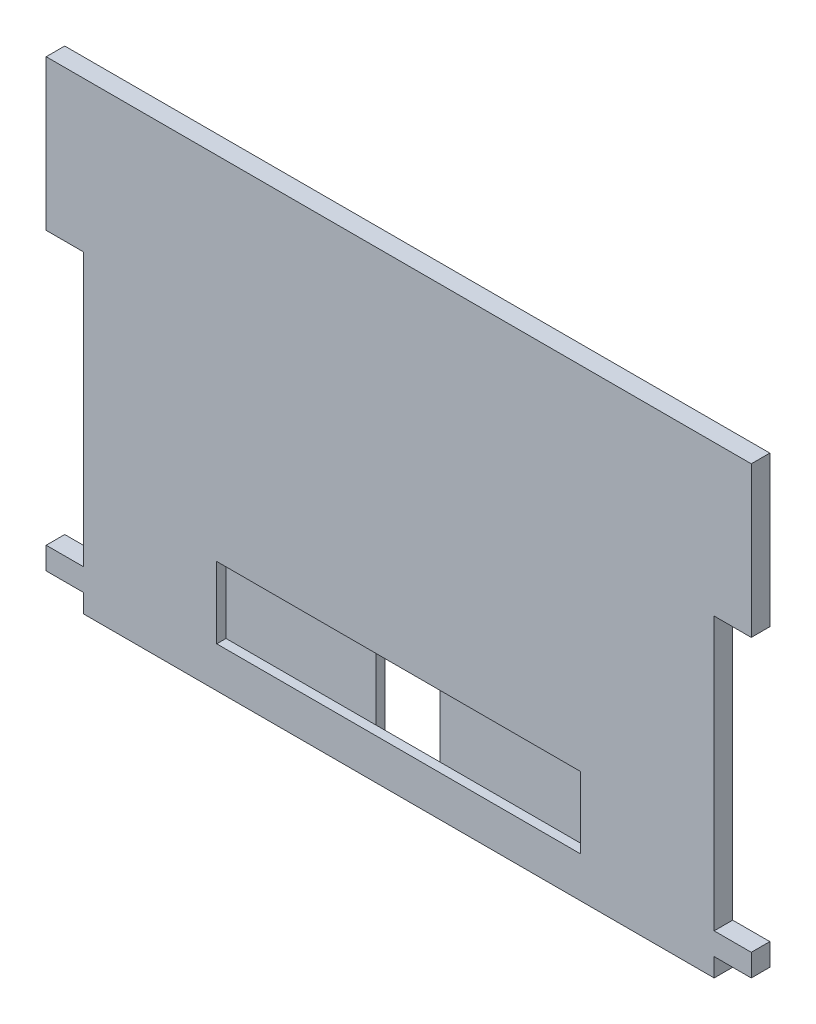
ISO-10303-21;
HEADER;
FILE_DESCRIPTION(('STEP AP214'),'2;1');
FILE_NAME('part.step','',(''),(''),'','','');
FILE_SCHEMA(('AUTOMOTIVE_DESIGN { 1 0 10303 214 1 1 1 1 }'));
ENDSEC;
DATA;
#1=APPLICATION_CONTEXT('core data for automotive mechanical design processes');
#2=APPLICATION_PROTOCOL_DEFINITION('international standard','automotive_design',2000,#1);
#3=PRODUCT_CONTEXT('',#1,'mechanical');
#4=PRODUCT('Part','Part','',(#3));
#5=PRODUCT_RELATED_PRODUCT_CATEGORY('part','',(#4));
#6=PRODUCT_DEFINITION_FORMATION('','',#4);
#7=PRODUCT_DEFINITION_CONTEXT('part definition',#1,'design');
#8=PRODUCT_DEFINITION('design','',#6,#7);
#9=PRODUCT_DEFINITION_SHAPE('','',#8);
#10=(LENGTH_UNIT() NAMED_UNIT(*) SI_UNIT(.MILLI.,.METRE.));
#11=(NAMED_UNIT(*) PLANE_ANGLE_UNIT() SI_UNIT($,.RADIAN.));
#12=(NAMED_UNIT(*) SI_UNIT($,.STERADIAN.) SOLID_ANGLE_UNIT());
#13=UNCERTAINTY_MEASURE_WITH_UNIT(LENGTH_MEASURE(1.E-05),#10,'distance_accuracy_value','');
#14=(GEOMETRIC_REPRESENTATION_CONTEXT(3) GLOBAL_UNCERTAINTY_ASSIGNED_CONTEXT((#13)) GLOBAL_UNIT_ASSIGNED_CONTEXT((#10,
#11,#12)) REPRESENTATION_CONTEXT('',''));
#15=CARTESIAN_POINT('',(0.,0.,0.));
#16=DIRECTION('',(0.,0.,1.));
#17=DIRECTION('',(1.,0.,0.));
#18=AXIS2_PLACEMENT_3D('',#15,#16,#17);
#19=CARTESIAN_POINT('',(0.,0.,1.));
#20=DIRECTION('',(0.,0.,-1.));
#21=DIRECTION('',(-1.,0.,0.));
#22=AXIS2_PLACEMENT_3D('',#19,#20,#21);
#23=PLANE('',#22);
#24=DIRECTION('',(1.,0.,0.));
#25=VECTOR('',#24,1.);
#26=CARTESIAN_POINT('',(-19.,1.5,1.));
#27=LINE('',#26,#25);
#28=CARTESIAN_POINT('',(-19.,1.5,1.));
#29=VERTEX_POINT('',#28);
#30=CARTESIAN_POINT('',(-17.,1.5,1.));
#31=VERTEX_POINT('',#30);
#32=EDGE_CURVE('E232',#29,#31,#27,.T.);
#33=ORIENTED_EDGE('',*,*,#32,.T.);
#34=DIRECTION('',(0.,-1.,0.));
#35=VECTOR('',#34,1.);
#36=CARTESIAN_POINT('',(-17.,1.5,1.));
#37=LINE('',#36,#35);
#38=CARTESIAN_POINT('',(-17.,0.5,1.));
#39=VERTEX_POINT('',#38);
#40=EDGE_CURVE('E131',#31,#39,#37,.T.);
#41=ORIENTED_EDGE('',*,*,#40,.T.);
#42=DIRECTION('',(1.,0.,0.));
#43=VECTOR('',#42,1.);
#44=CARTESIAN_POINT('',(-17.,0.5,1.));
#45=LINE('',#44,#43);
#46=CARTESIAN_POINT('',(17.,0.5,1.));
#47=VERTEX_POINT('',#46);
#48=EDGE_CURVE('E237',#39,#47,#45,.T.);
#49=ORIENTED_EDGE('',*,*,#48,.T.);
#50=DIRECTION('',(0.,1.,0.));
#51=VECTOR('',#50,1.);
#52=CARTESIAN_POINT('',(17.,0.5,1.));
#53=LINE('',#52,#51);
#54=CARTESIAN_POINT('',(17.,1.5,1.));
#55=VERTEX_POINT('',#54);
#56=EDGE_CURVE('E239',#47,#55,#53,.T.);
#57=ORIENTED_EDGE('',*,*,#56,.T.);
#58=DIRECTION('',(1.,0.,0.));
#59=VECTOR('',#58,1.);
#60=CARTESIAN_POINT('',(17.,1.5,1.));
#61=LINE('',#60,#59);
#62=CARTESIAN_POINT('',(19.,1.5,1.));
#63=VERTEX_POINT('',#62);
#64=EDGE_CURVE('E238',#55,#63,#61,.T.);
#65=ORIENTED_EDGE('',*,*,#64,.T.);
#66=DIRECTION('',(0.,1.,0.));
#67=VECTOR('',#66,1.);
#68=CARTESIAN_POINT('',(19.,1.5,1.));
#69=LINE('',#68,#67);
#70=CARTESIAN_POINT('',(19.,2.7,1.));
#71=VERTEX_POINT('',#70);
#72=EDGE_CURVE('E244',#63,#71,#69,.T.);
#73=ORIENTED_EDGE('',*,*,#72,.T.);
#74=DIRECTION('',(-1.,0.,0.));
#75=VECTOR('',#74,1.);
#76=CARTESIAN_POINT('',(19.,2.7,1.));
#77=LINE('',#76,#75);
#78=CARTESIAN_POINT('',(17.,2.7,1.));
#79=VERTEX_POINT('',#78);
#80=EDGE_CURVE('E241',#71,#79,#77,.T.);
#81=ORIENTED_EDGE('',*,*,#80,.T.);
#82=DIRECTION('',(0.,1.,0.));
#83=VECTOR('',#82,1.);
#84=CARTESIAN_POINT('',(17.,2.7,1.));
#85=LINE('',#84,#83);
#86=CARTESIAN_POINT('',(17.,17.3947217067352,1.));
#87=VERTEX_POINT('',#86);
#88=EDGE_CURVE('E247',#79,#87,#85,.T.);
#89=ORIENTED_EDGE('',*,*,#88,.T.);
#90=DIRECTION('',(1.,0.,0.));
#91=VECTOR('',#90,1.);
#92=CARTESIAN_POINT('',(17.,17.3947217067352,1.));
#93=LINE('',#92,#91);
#94=CARTESIAN_POINT('',(19.,17.3947217067352,1.));
#95=VERTEX_POINT('',#94);
#96=EDGE_CURVE('E246',#87,#95,#93,.T.);
#97=ORIENTED_EDGE('',*,*,#96,.T.);
#98=DIRECTION('',(0.,1.,0.));
#99=VECTOR('',#98,1.);
#100=CARTESIAN_POINT('',(19.,17.3947217067352,1.));
#101=LINE('',#100,#99);
#102=CARTESIAN_POINT('',(19.,25.5,1.));
#103=VERTEX_POINT('',#102);
#104=EDGE_CURVE('E248',#95,#103,#101,.T.);
#105=ORIENTED_EDGE('',*,*,#104,.T.);
#106=DIRECTION('',(-1.,0.,0.));
#107=VECTOR('',#106,1.);
#108=CARTESIAN_POINT('',(19.,25.5,1.));
#109=LINE('',#108,#107);
#110=CARTESIAN_POINT('',(-19.,25.5,1.));
#111=VERTEX_POINT('',#110);
#112=EDGE_CURVE('E254',#103,#111,#109,.T.);
#113=ORIENTED_EDGE('',*,*,#112,.T.);
#114=DIRECTION('',(0.,-1.,0.));
#115=VECTOR('',#114,1.);
#116=CARTESIAN_POINT('',(-19.,25.5,1.));
#117=LINE('',#116,#115);
#118=CARTESIAN_POINT('',(-19.,17.3947217067352,1.));
#119=VERTEX_POINT('',#118);
#120=EDGE_CURVE('E251',#111,#119,#117,.T.);
#121=ORIENTED_EDGE('',*,*,#120,.T.);
#122=DIRECTION('',(1.,0.,0.));
#123=VECTOR('',#122,1.);
#124=CARTESIAN_POINT('',(-19.,17.3947217067352,1.));
#125=LINE('',#124,#123);
#126=CARTESIAN_POINT('',(-17.,17.3947217067352,1.));
#127=VERTEX_POINT('',#126);
#128=EDGE_CURVE('E258',#119,#127,#125,.T.);
#129=ORIENTED_EDGE('',*,*,#128,.T.);
#130=DIRECTION('',(0.,-1.,0.));
#131=VECTOR('',#130,1.);
#132=CARTESIAN_POINT('',(-17.,17.3947217067352,1.));
#133=LINE('',#132,#131);
#134=CARTESIAN_POINT('',(-17.,2.7,1.));
#135=VERTEX_POINT('',#134);
#136=EDGE_CURVE('E256',#127,#135,#133,.T.);
#137=ORIENTED_EDGE('',*,*,#136,.T.);
#138=DIRECTION('',(-1.,0.,0.));
#139=VECTOR('',#138,1.);
#140=CARTESIAN_POINT('',(-17.,2.7,1.));
#141=LINE('',#140,#139);
#142=CARTESIAN_POINT('',(-19.,2.7,1.));
#143=VERTEX_POINT('',#142);
#144=EDGE_CURVE('E259',#135,#143,#141,.T.);
#145=ORIENTED_EDGE('',*,*,#144,.T.);
#146=DIRECTION('',(0.,-1.,0.));
#147=VECTOR('',#146,1.);
#148=CARTESIAN_POINT('',(-19.,2.7,1.));
#149=LINE('',#148,#147);
#150=EDGE_CURVE('E265',#143,#29,#149,.T.);
#151=ORIENTED_EDGE('',*,*,#150,.T.);
#152=EDGE_LOOP('',(#33,#41,#49,#57,#65,#73,#81,#89,#97,#105,#113,#121,#129,#137,#145,#151));
#153=FACE_BOUND('',#152,.T.);
#154=DIRECTION('',(0.,1.,0.));
#155=VECTOR('',#154,1.);
#156=CARTESIAN_POINT('',(-9.80769230769231,2.69230769230769,1.));
#157=LINE('',#156,#155);
#158=CARTESIAN_POINT('',(-9.80769230769231,2.69230769230769,1.));
#159=VERTEX_POINT('',#158);
#160=CARTESIAN_POINT('',(-9.80769230769231,6.53846153846154,1.));
#161=VERTEX_POINT('',#160);
#162=EDGE_CURVE('E58',#159,#161,#157,.T.);
#163=ORIENTED_EDGE('',*,*,#162,.T.);
#164=DIRECTION('',(1.,0.,0.));
#165=VECTOR('',#164,1.);
#166=CARTESIAN_POINT('',(-9.80769230769231,6.53846153846154,1.));
#167=LINE('',#166,#165);
#168=CARTESIAN_POINT('',(9.8076923076923,6.53846153846154,1.));
#169=VERTEX_POINT('',#168);
#170=EDGE_CURVE('E531',#161,#169,#167,.T.);
#171=ORIENTED_EDGE('',*,*,#170,.T.);
#172=DIRECTION('',(0.,-1.,0.));
#173=VECTOR('',#172,1.);
#174=CARTESIAN_POINT('',(9.8076923076923,6.53846153846154,1.));
#175=LINE('',#174,#173);
#176=CARTESIAN_POINT('',(9.8076923076923,2.69230769230769,1.));
#177=VERTEX_POINT('',#176);
#178=EDGE_CURVE('E519',#169,#177,#175,.T.);
#179=ORIENTED_EDGE('',*,*,#178,.T.);
#180=DIRECTION('',(-1.,0.,0.));
#181=VECTOR('',#180,1.);
#182=CARTESIAN_POINT('',(9.8076923076923,2.69230769230769,1.));
#183=LINE('',#182,#181);
#184=EDGE_CURVE('E530',#177,#159,#183,.T.);
#185=ORIENTED_EDGE('',*,*,#184,.T.);
#186=EDGE_LOOP('',(#163,#171,#179,#185));
#187=FACE_BOUND('',#186,.T.);
#188=ADVANCED_FACE('F39',(#153,#187),#23,.F.);
#189=CARTESIAN_POINT('',(0.,0.,0.5));
#190=DIRECTION('',(0.,0.,1.));
#191=DIRECTION('',(1.,0.,0.));
#192=AXIS2_PLACEMENT_3D('',#189,#190,#191);
#193=PLANE('',#192);
#194=DIRECTION('',(1.,0.,0.));
#195=VECTOR('',#194,1.);
#196=CARTESIAN_POINT('',(-9.80769230769231,6.53846153846154,0.5));
#197=LINE('',#196,#195);
#198=CARTESIAN_POINT('',(-1.73076923076922,6.53846153846154,0.5));
#199=VERTEX_POINT('',#198);
#200=CARTESIAN_POINT('',(1.73076923076924,6.53846153846154,0.5));
#201=VERTEX_POINT('',#200);
#202=EDGE_CURVE('E11',#199,#201,#197,.T.);
#203=ORIENTED_EDGE('',*,*,#202,.F.);
#204=DIRECTION('',(0.,-1.,0.));
#205=VECTOR('',#204,1.);
#206=CARTESIAN_POINT('',(-1.73076923076922,9.61538461538461,0.5));
#207=LINE('',#206,#205);
#208=CARTESIAN_POINT('',(-1.73076923076922,9.61538461538461,0.5));
#209=VERTEX_POINT('',#208);
#210=EDGE_CURVE('E560',#209,#199,#207,.T.);
#211=ORIENTED_EDGE('',*,*,#210,.F.);
#212=DIRECTION('',(-1.,0.,0.));
#213=VECTOR('',#212,1.);
#214=CARTESIAN_POINT('',(1.73076923076924,9.61538461538461,0.5));
#215=LINE('',#214,#213);
#216=CARTESIAN_POINT('',(1.73076923076924,9.61538461538461,0.5));
#217=VERTEX_POINT('',#216);
#218=EDGE_CURVE('E551',#217,#209,#215,.T.);
#219=ORIENTED_EDGE('',*,*,#218,.F.);
#220=DIRECTION('',(0.,1.,0.));
#221=VECTOR('',#220,1.);
#222=CARTESIAN_POINT('',(1.73076923076924,1.53846153846154,0.5));
#223=LINE('',#222,#221);
#224=EDGE_CURVE('E549',#201,#217,#223,.T.);
#225=ORIENTED_EDGE('',*,*,#224,.F.);
#226=EDGE_LOOP('',(#203,#211,#219,#225));
#227=FACE_BOUND('',#226,.T.);
#228=ADVANCED_FACE('F370',(#227),#193,.F.);
#229=DIRECTION('',(-1.,0.,0.));
#230=VECTOR('',#229,1.);
#231=CARTESIAN_POINT('',(9.8076923076923,2.69230769230769,0.5));
#232=LINE('',#231,#230);
#233=CARTESIAN_POINT('',(1.73076923076924,2.69230769230769,0.5));
#234=VERTEX_POINT('',#233);
#235=CARTESIAN_POINT('',(-1.73076923076922,2.69230769230769,0.5));
#236=VERTEX_POINT('',#235);
#237=EDGE_CURVE('E47',#234,#236,#232,.T.);
#238=ORIENTED_EDGE('',*,*,#237,.F.);
#239=CARTESIAN_POINT('',(1.73076923076924,1.53846153846154,0.5));
#240=VERTEX_POINT('',#239);
#241=EDGE_CURVE('E552',#240,#234,#223,.T.);
#242=ORIENTED_EDGE('',*,*,#241,.F.);
#243=DIRECTION('',(-1.,0.,0.));
#244=VECTOR('',#243,1.);
#245=CARTESIAN_POINT('',(9.80769230769232,1.53846153846154,0.5));
#246=LINE('',#245,#244);
#247=CARTESIAN_POINT('',(9.80769230769232,1.53846153846154,0.5));
#248=VERTEX_POINT('',#247);
#249=EDGE_CURVE('E547',#248,#240,#246,.T.);
#250=ORIENTED_EDGE('',*,*,#249,.F.);
#251=DIRECTION('',(0.,1.,0.));
#252=VECTOR('',#251,1.);
#253=CARTESIAN_POINT('',(9.80769230769232,-1.92307692307692,0.5));
#254=LINE('',#253,#252);
#255=CARTESIAN_POINT('',(9.80769230769232,0.5,0.5));
#256=VERTEX_POINT('',#255);
#257=EDGE_CURVE('E193',#256,#248,#254,.T.);
#258=ORIENTED_EDGE('',*,*,#257,.F.);
#259=DIRECTION('',(1.,0.,0.));
#260=VECTOR('',#259,1.);
#261=CARTESIAN_POINT('',(-17.,0.5,0.5));
#262=LINE('',#261,#260);
#263=CARTESIAN_POINT('',(-9.8076923076923,0.5,0.5));
#264=VERTEX_POINT('',#263);
#265=EDGE_CURVE('E262',#264,#256,#262,.T.);
#266=ORIENTED_EDGE('',*,*,#265,.F.);
#267=DIRECTION('',(0.,-1.,0.));
#268=VECTOR('',#267,1.);
#269=CARTESIAN_POINT('',(-9.8076923076923,1.53846153846154,0.5));
#270=LINE('',#269,#268);
#271=CARTESIAN_POINT('',(-9.8076923076923,1.53846153846154,0.5));
#272=VERTEX_POINT('',#271);
#273=EDGE_CURVE('E210',#272,#264,#270,.T.);
#274=ORIENTED_EDGE('',*,*,#273,.F.);
#275=DIRECTION('',(-1.,0.,0.));
#276=VECTOR('',#275,1.);
#277=CARTESIAN_POINT('',(-1.73076923076922,1.53846153846154,0.5));
#278=LINE('',#277,#276);
#279=CARTESIAN_POINT('',(-1.73076923076922,1.53846153846154,0.5));
#280=VERTEX_POINT('',#279);
#281=EDGE_CURVE('E207',#280,#272,#278,.T.);
#282=ORIENTED_EDGE('',*,*,#281,.F.);
#283=EDGE_CURVE('E559',#236,#280,#207,.T.);
#284=ORIENTED_EDGE('',*,*,#283,.F.);
#285=EDGE_LOOP('',(#238,#242,#250,#258,#266,#274,#282,#284));
#286=FACE_BOUND('',#285,.T.);
#287=ADVANCED_FACE('F373',(#286),#193,.F.);
#288=CARTESIAN_POINT('',(-17.,0.5,1.));
#289=DIRECTION('',(0.,1.,0.));
#290=DIRECTION('',(0.,0.,1.));
#291=AXIS2_PLACEMENT_3D('',#288,#289,#290);
#292=PLANE('',#291);
#293=DIRECTION('',(0.,0.,1.));
#294=VECTOR('',#293,1.);
#295=CARTESIAN_POINT('',(9.80769230769232,0.5,1.));
#296=LINE('',#295,#294);
#297=CARTESIAN_POINT('',(9.80769230769232,0.5,0.));
#298=VERTEX_POINT('',#297);
#299=EDGE_CURVE('E313',#298,#256,#296,.T.);
#300=ORIENTED_EDGE('',*,*,#299,.F.);
#301=DIRECTION('',(1.,0.,0.));
#302=VECTOR('',#301,1.);
#303=CARTESIAN_POINT('',(-17.,0.5,0.));
#304=LINE('',#303,#302);
#305=CARTESIAN_POINT('',(17.,0.5,0.));
#306=VERTEX_POINT('',#305);
#307=EDGE_CURVE('E325',#298,#306,#304,.T.);
#308=ORIENTED_EDGE('',*,*,#307,.T.);
#309=DIRECTION('',(0.,0.,-1.));
#310=VECTOR('',#309,1.);
#311=CARTESIAN_POINT('',(17.,0.5,1.));
#312=LINE('',#311,#310);
#313=EDGE_CURVE('E276',#47,#306,#312,.T.);
#314=ORIENTED_EDGE('',*,*,#313,.F.);
#315=ORIENTED_EDGE('',*,*,#48,.F.);
#316=DIRECTION('',(0.,0.,-1.));
#317=VECTOR('',#316,1.);
#318=CARTESIAN_POINT('',(-17.,0.5,1.));
#319=LINE('',#318,#317);
#320=CARTESIAN_POINT('',(-17.,0.5,0.));
#321=VERTEX_POINT('',#320);
#322=EDGE_CURVE('E273',#39,#321,#319,.T.);
#323=ORIENTED_EDGE('',*,*,#322,.T.);
#324=DIRECTION('',(1.,0.,0.));
#325=VECTOR('',#324,1.);
#326=CARTESIAN_POINT('',(-17.,0.5,0.));
#327=LINE('',#326,#325);
#328=CARTESIAN_POINT('',(-9.8076923076923,0.5,0.));
#329=VERTEX_POINT('',#328);
#330=EDGE_CURVE('E317',#321,#329,#327,.T.);
#331=ORIENTED_EDGE('',*,*,#330,.T.);
#332=DIRECTION('',(0.,0.,-1.));
#333=VECTOR('',#332,1.);
#334=CARTESIAN_POINT('',(-9.8076923076923,0.5,1.));
#335=LINE('',#334,#333);
#336=EDGE_CURVE('E189',#264,#329,#335,.T.);
#337=ORIENTED_EDGE('',*,*,#336,.F.);
#338=ORIENTED_EDGE('',*,*,#265,.T.);
#339=EDGE_LOOP('',(#300,#308,#314,#315,#323,#331,#337,#338));
#340=FACE_BOUND('',#339,.T.);
#341=ADVANCED_FACE('F383',(#340),#292,.F.);
#342=CARTESIAN_POINT('',(0.,0.,0.));
#343=DIRECTION('',(0.,0.,-1.));
#344=DIRECTION('',(-1.,0.,0.));
#345=AXIS2_PLACEMENT_3D('',#342,#343,#344);
#346=PLANE('',#345);
#347=DIRECTION('',(-1.,0.,0.));
#348=VECTOR('',#347,1.);
#349=CARTESIAN_POINT('',(-1.73076923076922,1.53846153846154,0.));
#350=LINE('',#349,#348);
#351=CARTESIAN_POINT('',(-1.73076923076922,1.53846153846154,0.));
#352=VERTEX_POINT('',#351);
#353=CARTESIAN_POINT('',(-9.8076923076923,1.53846153846154,0.));
#354=VERTEX_POINT('',#353);
#355=EDGE_CURVE('E197',#352,#354,#350,.T.);
#356=ORIENTED_EDGE('',*,*,#355,.T.);
#357=DIRECTION('',(0.,-1.,0.));
#358=VECTOR('',#357,1.);
#359=CARTESIAN_POINT('',(-9.8076923076923,1.53846153846154,0.));
#360=LINE('',#359,#358);
#361=EDGE_CURVE('E185',#354,#329,#360,.T.);
#362=ORIENTED_EDGE('',*,*,#361,.T.);
#363=ORIENTED_EDGE('',*,*,#330,.F.);
#364=DIRECTION('',(0.,1.,0.));
#365=VECTOR('',#364,1.);
#366=CARTESIAN_POINT('',(-17.,1.5,0.));
#367=LINE('',#366,#365);
#368=CARTESIAN_POINT('',(-17.,1.5,0.));
#369=VERTEX_POINT('',#368);
#370=EDGE_CURVE('E323',#369,#321,#367,.F.);
#371=ORIENTED_EDGE('',*,*,#370,.F.);
#372=DIRECTION('',(-1.,0.,0.));
#373=VECTOR('',#372,1.);
#374=CARTESIAN_POINT('',(-19.,1.5,0.));
#375=LINE('',#374,#373);
#376=CARTESIAN_POINT('',(-19.,1.5,0.));
#377=VERTEX_POINT('',#376);
#378=EDGE_CURVE('E43',#377,#369,#375,.F.);
#379=ORIENTED_EDGE('',*,*,#378,.F.);
#380=DIRECTION('',(0.,1.,0.));
#381=VECTOR('',#380,1.);
#382=CARTESIAN_POINT('',(-19.,2.7,0.));
#383=LINE('',#382,#381);
#384=CARTESIAN_POINT('',(-19.,2.7,0.));
#385=VERTEX_POINT('',#384);
#386=EDGE_CURVE('E122',#385,#377,#383,.F.);
#387=ORIENTED_EDGE('',*,*,#386,.F.);
#388=DIRECTION('',(1.,0.,0.));
#389=VECTOR('',#388,1.);
#390=CARTESIAN_POINT('',(-17.,2.7,0.));
#391=LINE('',#390,#389);
#392=CARTESIAN_POINT('',(-17.,2.7,0.));
#393=VERTEX_POINT('',#392);
#394=EDGE_CURVE('E327',#393,#385,#391,.F.);
#395=ORIENTED_EDGE('',*,*,#394,.F.);
#396=DIRECTION('',(0.,1.,0.));
#397=VECTOR('',#396,1.);
#398=CARTESIAN_POINT('',(-17.,17.3947217067352,0.));
#399=LINE('',#398,#397);
#400=CARTESIAN_POINT('',(-17.,17.3947217067352,0.));
#401=VERTEX_POINT('',#400);
#402=EDGE_CURVE('E329',#401,#393,#399,.F.);
#403=ORIENTED_EDGE('',*,*,#402,.F.);
#404=DIRECTION('',(1.,0.,0.));
#405=VECTOR('',#404,1.);
#406=CARTESIAN_POINT('',(-19.,17.3947217067352,0.));
#407=LINE('',#406,#405);
#408=CARTESIAN_POINT('',(-19.,17.3947217067352,0.));
#409=VERTEX_POINT('',#408);
#410=EDGE_CURVE('E328',#409,#401,#407,.T.);
#411=ORIENTED_EDGE('',*,*,#410,.F.);
#412=DIRECTION('',(0.,1.,0.));
#413=VECTOR('',#412,1.);
#414=CARTESIAN_POINT('',(-19.,25.5,0.));
#415=LINE('',#414,#413);
#416=CARTESIAN_POINT('',(-19.,25.5,0.));
#417=VERTEX_POINT('',#416);
#418=EDGE_CURVE('E334',#417,#409,#415,.F.);
#419=ORIENTED_EDGE('',*,*,#418,.F.);
#420=DIRECTION('',(1.,0.,0.));
#421=VECTOR('',#420,1.);
#422=CARTESIAN_POINT('',(19.,25.5,0.));
#423=LINE('',#422,#421);
#424=CARTESIAN_POINT('',(19.,25.5,0.));
#425=VERTEX_POINT('',#424);
#426=EDGE_CURVE('E331',#425,#417,#423,.F.);
#427=ORIENTED_EDGE('',*,*,#426,.F.);
#428=DIRECTION('',(0.,1.,0.));
#429=VECTOR('',#428,1.);
#430=CARTESIAN_POINT('',(19.,17.3947217067352,0.));
#431=LINE('',#430,#429);
#432=CARTESIAN_POINT('',(19.,17.3947217067352,0.));
#433=VERTEX_POINT('',#432);
#434=EDGE_CURVE('E337',#433,#425,#431,.T.);
#435=ORIENTED_EDGE('',*,*,#434,.F.);
#436=DIRECTION('',(1.,0.,0.));
#437=VECTOR('',#436,1.);
#438=CARTESIAN_POINT('',(17.,17.3947217067352,0.));
#439=LINE('',#438,#437);
#440=CARTESIAN_POINT('',(17.,17.3947217067352,0.));
#441=VERTEX_POINT('',#440);
#442=EDGE_CURVE('E336',#441,#433,#439,.T.);
#443=ORIENTED_EDGE('',*,*,#442,.F.);
#444=DIRECTION('',(0.,1.,0.));
#445=VECTOR('',#444,1.);
#446=CARTESIAN_POINT('',(17.,2.7,0.));
#447=LINE('',#446,#445);
#448=CARTESIAN_POINT('',(17.,2.7,0.));
#449=VERTEX_POINT('',#448);
#450=EDGE_CURVE('E338',#449,#441,#447,.T.);
#451=ORIENTED_EDGE('',*,*,#450,.F.);
#452=DIRECTION('',(1.,0.,0.));
#453=VECTOR('',#452,1.);
#454=CARTESIAN_POINT('',(19.,2.7,0.));
#455=LINE('',#454,#453);
#456=CARTESIAN_POINT('',(19.,2.7,0.));
#457=VERTEX_POINT('',#456);
#458=EDGE_CURVE('E344',#457,#449,#455,.F.);
#459=ORIENTED_EDGE('',*,*,#458,.F.);
#460=DIRECTION('',(0.,1.,0.));
#461=VECTOR('',#460,1.);
#462=CARTESIAN_POINT('',(19.,1.5,0.));
#463=LINE('',#462,#461);
#464=CARTESIAN_POINT('',(19.,1.5,0.));
#465=VERTEX_POINT('',#464);
#466=EDGE_CURVE('E341',#465,#457,#463,.T.);
#467=ORIENTED_EDGE('',*,*,#466,.F.);
#468=DIRECTION('',(-1.,0.,0.));
#469=VECTOR('',#468,1.);
#470=CARTESIAN_POINT('',(17.,1.5,0.));
#471=LINE('',#470,#469);
#472=CARTESIAN_POINT('',(17.,1.5,0.));
#473=VERTEX_POINT('',#472);
#474=EDGE_CURVE('E348',#473,#465,#471,.F.);
#475=ORIENTED_EDGE('',*,*,#474,.F.);
#476=DIRECTION('',(0.,1.,0.));
#477=VECTOR('',#476,1.);
#478=CARTESIAN_POINT('',(17.,0.5,0.));
#479=LINE('',#478,#477);
#480=EDGE_CURVE('E321',#306,#473,#479,.T.);
#481=ORIENTED_EDGE('',*,*,#480,.F.);
#482=ORIENTED_EDGE('',*,*,#307,.F.);
#483=DIRECTION('',(0.,1.,0.));
#484=VECTOR('',#483,1.);
#485=CARTESIAN_POINT('',(9.80769230769232,-1.92307692307692,0.));
#486=LINE('',#485,#484);
#487=CARTESIAN_POINT('',(9.80769230769232,1.53846153846154,0.));
#488=VERTEX_POINT('',#487);
#489=EDGE_CURVE('E268',#298,#488,#486,.T.);
#490=ORIENTED_EDGE('',*,*,#489,.T.);
#491=DIRECTION('',(-1.,0.,0.));
#492=VECTOR('',#491,1.);
#493=CARTESIAN_POINT('',(9.80769230769232,1.53846153846154,0.));
#494=LINE('',#493,#492);
#495=CARTESIAN_POINT('',(1.73076923076924,1.53846153846154,0.));
#496=VERTEX_POINT('',#495);
#497=EDGE_CURVE('E537',#488,#496,#494,.T.);
#498=ORIENTED_EDGE('',*,*,#497,.T.);
#499=DIRECTION('',(0.,1.,0.));
#500=VECTOR('',#499,1.);
#501=CARTESIAN_POINT('',(1.73076923076924,1.53846153846154,0.));
#502=LINE('',#501,#500);
#503=CARTESIAN_POINT('',(1.73076923076924,9.61538461538461,0.));
#504=VERTEX_POINT('',#503);
#505=EDGE_CURVE('E563',#496,#504,#502,.T.);
#506=ORIENTED_EDGE('',*,*,#505,.T.);
#507=DIRECTION('',(-1.,0.,0.));
#508=VECTOR('',#507,1.);
#509=CARTESIAN_POINT('',(1.73076923076924,9.61538461538461,0.));
#510=LINE('',#509,#508);
#511=CARTESIAN_POINT('',(-1.73076923076922,9.61538461538461,0.));
#512=VERTEX_POINT('',#511);
#513=EDGE_CURVE('E214',#504,#512,#510,.T.);
#514=ORIENTED_EDGE('',*,*,#513,.T.);
#515=DIRECTION('',(0.,-1.,0.));
#516=VECTOR('',#515,1.);
#517=CARTESIAN_POINT('',(-1.73076923076922,9.61538461538461,0.));
#518=LINE('',#517,#516);
#519=EDGE_CURVE('E211',#512,#352,#518,.T.);
#520=ORIENTED_EDGE('',*,*,#519,.T.);
#521=EDGE_LOOP('',(#356,#362,#363,#371,#379,#387,#395,#403,#411,#419,#427,#435,#443,#451,#459,
#467,#475,#481,#482,#490,#498,#506,#514,#520));
#522=FACE_BOUND('',#521,.T.);
#523=ADVANCED_FACE('F208',(#522),#346,.T.);
#524=CARTESIAN_POINT('',(-19.,1.5,1.));
#525=DIRECTION('',(0.,1.,0.));
#526=DIRECTION('',(-1.,0.,0.));
#527=AXIS2_PLACEMENT_3D('',#524,#525,#526);
#528=PLANE('',#527);
#529=ORIENTED_EDGE('',*,*,#378,.T.);
#530=DIRECTION('',(0.,0.,-1.));
#531=VECTOR('',#530,1.);
#532=CARTESIAN_POINT('',(-17.,1.5,1.));
#533=LINE('',#532,#531);
#534=EDGE_CURVE('E271',#31,#369,#533,.T.);
#535=ORIENTED_EDGE('',*,*,#534,.F.);
#536=ORIENTED_EDGE('',*,*,#32,.F.);
#537=DIRECTION('',(0.,0.,-1.));
#538=VECTOR('',#537,1.);
#539=CARTESIAN_POINT('',(-19.,1.5,1.));
#540=LINE('',#539,#538);
#541=EDGE_CURVE('E264',#29,#377,#540,.T.);
#542=ORIENTED_EDGE('',*,*,#541,.T.);
#543=EDGE_LOOP('',(#529,#535,#536,#542));
#544=FACE_BOUND('',#543,.T.);
#545=ADVANCED_FACE('F41',(#544),#528,.F.);
#546=CARTESIAN_POINT('',(-17.,1.5,1.));
#547=DIRECTION('',(1.,0.,0.));
#548=DIRECTION('',(0.,0.,-1.));
#549=AXIS2_PLACEMENT_3D('',#546,#547,#548);
#550=PLANE('',#549);
#551=ORIENTED_EDGE('',*,*,#370,.T.);
#552=ORIENTED_EDGE('',*,*,#322,.F.);
#553=ORIENTED_EDGE('',*,*,#40,.F.);
#554=ORIENTED_EDGE('',*,*,#534,.T.);
#555=EDGE_LOOP('',(#551,#552,#553,#554));
#556=FACE_BOUND('',#555,.T.);
#557=ADVANCED_FACE('F352',(#556),#550,.F.);
#558=CARTESIAN_POINT('',(17.,0.5,1.));
#559=DIRECTION('',(-1.,0.,0.));
#560=DIRECTION('',(0.,0.,1.));
#561=AXIS2_PLACEMENT_3D('',#558,#559,#560);
#562=PLANE('',#561);
#563=ORIENTED_EDGE('',*,*,#480,.T.);
#564=DIRECTION('',(0.,0.,-1.));
#565=VECTOR('',#564,1.);
#566=CARTESIAN_POINT('',(17.,1.5,1.));
#567=LINE('',#566,#565);
#568=EDGE_CURVE('E278',#55,#473,#567,.T.);
#569=ORIENTED_EDGE('',*,*,#568,.F.);
#570=ORIENTED_EDGE('',*,*,#56,.F.);
#571=ORIENTED_EDGE('',*,*,#313,.T.);
#572=EDGE_LOOP('',(#563,#569,#570,#571));
#573=FACE_BOUND('',#572,.T.);
#574=ADVANCED_FACE('F360',(#573),#562,.F.);
#575=CARTESIAN_POINT('',(17.,1.5,1.));
#576=DIRECTION('',(0.,1.,0.));
#577=DIRECTION('',(-1.,0.,0.));
#578=AXIS2_PLACEMENT_3D('',#575,#576,#577);
#579=PLANE('',#578);
#580=ORIENTED_EDGE('',*,*,#474,.T.);
#581=DIRECTION('',(0.,0.,-1.));
#582=VECTOR('',#581,1.);
#583=CARTESIAN_POINT('',(19.,1.5,1.));
#584=LINE('',#583,#582);
#585=EDGE_CURVE('E285',#63,#465,#584,.T.);
#586=ORIENTED_EDGE('',*,*,#585,.F.);
#587=ORIENTED_EDGE('',*,*,#64,.F.);
#588=ORIENTED_EDGE('',*,*,#568,.T.);
#589=EDGE_LOOP('',(#580,#586,#587,#588));
#590=FACE_BOUND('',#589,.T.);
#591=ADVANCED_FACE('F365',(#590),#579,.F.);
#592=CARTESIAN_POINT('',(19.,1.5,1.));
#593=DIRECTION('',(-1.,0.,0.));
#594=DIRECTION('',(0.,0.,1.));
#595=AXIS2_PLACEMENT_3D('',#592,#593,#594);
#596=PLANE('',#595);
#597=ORIENTED_EDGE('',*,*,#466,.T.);
#598=DIRECTION('',(0.,0.,-1.));
#599=VECTOR('',#598,1.);
#600=CARTESIAN_POINT('',(19.,2.7,1.));
#601=LINE('',#600,#599);
#602=EDGE_CURVE('E283',#71,#457,#601,.T.);
#603=ORIENTED_EDGE('',*,*,#602,.F.);
#604=ORIENTED_EDGE('',*,*,#72,.F.);
#605=ORIENTED_EDGE('',*,*,#585,.T.);
#606=EDGE_LOOP('',(#597,#603,#604,#605));
#607=FACE_BOUND('',#606,.T.);
#608=ADVANCED_FACE('F421',(#607),#596,.F.);
#609=CARTESIAN_POINT('',(19.,2.7,1.));
#610=DIRECTION('',(0.,-1.,0.));
#611=DIRECTION('',(0.,0.,-1.));
#612=AXIS2_PLACEMENT_3D('',#609,#610,#611);
#613=PLANE('',#612);
#614=ORIENTED_EDGE('',*,*,#458,.T.);
#615=DIRECTION('',(0.,0.,-1.));
#616=VECTOR('',#615,1.);
#617=CARTESIAN_POINT('',(17.,2.7,1.));
#618=LINE('',#617,#616);
#619=EDGE_CURVE('E290',#79,#449,#618,.T.);
#620=ORIENTED_EDGE('',*,*,#619,.F.);
#621=ORIENTED_EDGE('',*,*,#80,.F.);
#622=ORIENTED_EDGE('',*,*,#602,.T.);
#623=EDGE_LOOP('',(#614,#620,#621,#622));
#624=FACE_BOUND('',#623,.T.);
#625=ADVANCED_FACE('F418',(#624),#613,.F.);
#626=CARTESIAN_POINT('',(17.,2.7,1.));
#627=DIRECTION('',(-1.,0.,0.));
#628=DIRECTION('',(0.,0.,1.));
#629=AXIS2_PLACEMENT_3D('',#626,#627,#628);
#630=PLANE('',#629);
#631=ORIENTED_EDGE('',*,*,#450,.T.);
#632=DIRECTION('',(0.,0.,-1.));
#633=VECTOR('',#632,1.);
#634=CARTESIAN_POINT('',(17.,17.3947217067352,1.));
#635=LINE('',#634,#633);
#636=EDGE_CURVE('E292',#87,#441,#635,.T.);
#637=ORIENTED_EDGE('',*,*,#636,.F.);
#638=ORIENTED_EDGE('',*,*,#88,.F.);
#639=ORIENTED_EDGE('',*,*,#619,.T.);
#640=EDGE_LOOP('',(#631,#637,#638,#639));
#641=FACE_BOUND('',#640,.T.);
#642=ADVANCED_FACE('F417',(#641),#630,.F.);
#643=CARTESIAN_POINT('',(17.,17.3947217067352,1.));
#644=DIRECTION('',(0.,1.,0.));
#645=DIRECTION('',(0.,0.,1.));
#646=AXIS2_PLACEMENT_3D('',#643,#644,#645);
#647=PLANE('',#646);
#648=ORIENTED_EDGE('',*,*,#442,.T.);
#649=DIRECTION('',(0.,0.,-1.));
#650=VECTOR('',#649,1.);
#651=CARTESIAN_POINT('',(19.,17.3947217067352,1.));
#652=LINE('',#651,#650);
#653=EDGE_CURVE('E294',#95,#433,#652,.T.);
#654=ORIENTED_EDGE('',*,*,#653,.F.);
#655=ORIENTED_EDGE('',*,*,#96,.F.);
#656=ORIENTED_EDGE('',*,*,#636,.T.);
#657=EDGE_LOOP('',(#648,#654,#655,#656));
#658=FACE_BOUND('',#657,.T.);
#659=ADVANCED_FACE('F415',(#658),#647,.F.);
#660=CARTESIAN_POINT('',(19.,17.3947217067352,1.));
#661=DIRECTION('',(-1.,0.,0.));
#662=DIRECTION('',(0.,0.,1.));
#663=AXIS2_PLACEMENT_3D('',#660,#661,#662);
#664=PLANE('',#663);
#665=ORIENTED_EDGE('',*,*,#434,.T.);
#666=DIRECTION('',(0.,0.,-1.));
#667=VECTOR('',#666,1.);
#668=CARTESIAN_POINT('',(19.,25.5,1.));
#669=LINE('',#668,#667);
#670=EDGE_CURVE('E299',#103,#425,#669,.T.);
#671=ORIENTED_EDGE('',*,*,#670,.F.);
#672=ORIENTED_EDGE('',*,*,#104,.F.);
#673=ORIENTED_EDGE('',*,*,#653,.T.);
#674=EDGE_LOOP('',(#665,#671,#672,#673));
#675=FACE_BOUND('',#674,.T.);
#676=ADVANCED_FACE('F408',(#675),#664,.F.);
#677=CARTESIAN_POINT('',(19.,25.5,1.));
#678=DIRECTION('',(0.,-1.,0.));
#679=DIRECTION('',(0.,0.,-1.));
#680=AXIS2_PLACEMENT_3D('',#677,#678,#679);
#681=PLANE('',#680);
#682=ORIENTED_EDGE('',*,*,#426,.T.);
#683=DIRECTION('',(0.,0.,-1.));
#684=VECTOR('',#683,1.);
#685=CARTESIAN_POINT('',(-19.,25.5,1.));
#686=LINE('',#685,#684);
#687=EDGE_CURVE('E298',#111,#417,#686,.T.);
#688=ORIENTED_EDGE('',*,*,#687,.F.);
#689=ORIENTED_EDGE('',*,*,#112,.F.);
#690=ORIENTED_EDGE('',*,*,#670,.T.);
#691=EDGE_LOOP('',(#682,#688,#689,#690));
#692=FACE_BOUND('',#691,.T.);
#693=ADVANCED_FACE('F402',(#692),#681,.F.);
#694=CARTESIAN_POINT('',(-19.,25.5,1.));
#695=DIRECTION('',(1.,0.,0.));
#696=DIRECTION('',(0.,0.,-1.));
#697=AXIS2_PLACEMENT_3D('',#694,#695,#696);
#698=PLANE('',#697);
#699=ORIENTED_EDGE('',*,*,#418,.T.);
#700=DIRECTION('',(0.,0.,-1.));
#701=VECTOR('',#700,1.);
#702=CARTESIAN_POINT('',(-19.,17.3947217067352,1.));
#703=LINE('',#702,#701);
#704=EDGE_CURVE('E301',#119,#409,#703,.T.);
#705=ORIENTED_EDGE('',*,*,#704,.F.);
#706=ORIENTED_EDGE('',*,*,#120,.F.);
#707=ORIENTED_EDGE('',*,*,#687,.T.);
#708=EDGE_LOOP('',(#699,#705,#706,#707));
#709=FACE_BOUND('',#708,.T.);
#710=ADVANCED_FACE('F397',(#709),#698,.F.);
#711=CARTESIAN_POINT('',(-19.,17.3947217067352,1.));
#712=DIRECTION('',(0.,1.,0.));
#713=DIRECTION('',(0.,0.,1.));
#714=AXIS2_PLACEMENT_3D('',#711,#712,#713);
#715=PLANE('',#714);
#716=ORIENTED_EDGE('',*,*,#410,.T.);
#717=DIRECTION('',(0.,0.,-1.));
#718=VECTOR('',#717,1.);
#719=CARTESIAN_POINT('',(-17.,17.3947217067352,1.));
#720=LINE('',#719,#718);
#721=EDGE_CURVE('E308',#127,#401,#720,.T.);
#722=ORIENTED_EDGE('',*,*,#721,.F.);
#723=ORIENTED_EDGE('',*,*,#128,.F.);
#724=ORIENTED_EDGE('',*,*,#704,.T.);
#725=EDGE_LOOP('',(#716,#722,#723,#724));
#726=FACE_BOUND('',#725,.T.);
#727=ADVANCED_FACE('F398',(#726),#715,.F.);
#728=CARTESIAN_POINT('',(-17.,17.3947217067352,1.));
#729=DIRECTION('',(1.,0.,0.));
#730=DIRECTION('',(0.,0.,-1.));
#731=AXIS2_PLACEMENT_3D('',#728,#729,#730);
#732=PLANE('',#731);
#733=ORIENTED_EDGE('',*,*,#402,.T.);
#734=DIRECTION('',(0.,0.,-1.));
#735=VECTOR('',#734,1.);
#736=CARTESIAN_POINT('',(-17.,2.7,1.));
#737=LINE('',#736,#735);
#738=EDGE_CURVE('E309',#135,#393,#737,.T.);
#739=ORIENTED_EDGE('',*,*,#738,.F.);
#740=ORIENTED_EDGE('',*,*,#136,.F.);
#741=ORIENTED_EDGE('',*,*,#721,.T.);
#742=EDGE_LOOP('',(#733,#739,#740,#741));
#743=FACE_BOUND('',#742,.T.);
#744=ADVANCED_FACE('F392',(#743),#732,.F.);
#745=CARTESIAN_POINT('',(-17.,2.7,1.));
#746=DIRECTION('',(0.,-1.,0.));
#747=DIRECTION('',(0.,0.,-1.));
#748=AXIS2_PLACEMENT_3D('',#745,#746,#747);
#749=PLANE('',#748);
#750=ORIENTED_EDGE('',*,*,#394,.T.);
#751=DIRECTION('',(0.,0.,-1.));
#752=VECTOR('',#751,1.);
#753=CARTESIAN_POINT('',(-19.,2.7,1.));
#754=LINE('',#753,#752);
#755=EDGE_CURVE('E269',#143,#385,#754,.T.);
#756=ORIENTED_EDGE('',*,*,#755,.F.);
#757=ORIENTED_EDGE('',*,*,#144,.F.);
#758=ORIENTED_EDGE('',*,*,#738,.T.);
#759=EDGE_LOOP('',(#750,#756,#757,#758));
#760=FACE_BOUND('',#759,.T.);
#761=ADVANCED_FACE('F386',(#760),#749,.F.);
#762=CARTESIAN_POINT('',(-19.,2.7,1.));
#763=DIRECTION('',(1.,0.,0.));
#764=DIRECTION('',(0.,0.,-1.));
#765=AXIS2_PLACEMENT_3D('',#762,#763,#764);
#766=PLANE('',#765);
#767=ORIENTED_EDGE('',*,*,#386,.T.);
#768=ORIENTED_EDGE('',*,*,#541,.F.);
#769=ORIENTED_EDGE('',*,*,#150,.F.);
#770=ORIENTED_EDGE('',*,*,#755,.T.);
#771=EDGE_LOOP('',(#767,#768,#769,#770));
#772=FACE_BOUND('',#771,.T.);
#773=ADVANCED_FACE('F387',(#772),#766,.F.);
#774=CARTESIAN_POINT('',(9.80769230769232,-1.92307692307692,0.5));
#775=DIRECTION('',(-1.,0.,0.));
#776=DIRECTION('',(0.,0.,1.));
#777=AXIS2_PLACEMENT_3D('',#774,#775,#776);
#778=PLANE('',#777);
#779=ORIENTED_EDGE('',*,*,#299,.T.);
#780=ORIENTED_EDGE('',*,*,#257,.T.);
#781=DIRECTION('',(0.,0.,-1.));
#782=VECTOR('',#781,1.);
#783=CARTESIAN_POINT('',(9.80769230769232,1.53846153846154,0.5));
#784=LINE('',#783,#782);
#785=EDGE_CURVE('E229',#248,#488,#784,.T.);
#786=ORIENTED_EDGE('',*,*,#785,.T.);
#787=ORIENTED_EDGE('',*,*,#489,.F.);
#788=EDGE_LOOP('',(#779,#780,#786,#787));
#789=FACE_BOUND('',#788,.T.);
#790=ADVANCED_FACE('F382',(#789),#778,.T.);
#791=CARTESIAN_POINT('',(-9.8076923076923,1.53846153846154,0.5));
#792=DIRECTION('',(1.,0.,0.));
#793=DIRECTION('',(0.,0.,-1.));
#794=AXIS2_PLACEMENT_3D('',#791,#792,#793);
#795=PLANE('',#794);
#796=ORIENTED_EDGE('',*,*,#336,.T.);
#797=ORIENTED_EDGE('',*,*,#361,.F.);
#798=DIRECTION('',(0.,0.,-1.));
#799=VECTOR('',#798,1.);
#800=CARTESIAN_POINT('',(-9.8076923076923,1.53846153846154,0.5));
#801=LINE('',#800,#799);
#802=EDGE_CURVE('E190',#272,#354,#801,.T.);
#803=ORIENTED_EDGE('',*,*,#802,.F.);
#804=ORIENTED_EDGE('',*,*,#273,.T.);
#805=EDGE_LOOP('',(#796,#797,#803,#804));
#806=FACE_BOUND('',#805,.T.);
#807=ADVANCED_FACE('F182',(#806),#795,.T.);
#808=CARTESIAN_POINT('',(9.80769230769232,1.53846153846154,0.5));
#809=DIRECTION('',(0.,-1.,0.));
#810=DIRECTION('',(0.,0.,-1.));
#811=AXIS2_PLACEMENT_3D('',#808,#809,#810);
#812=PLANE('',#811);
#813=ORIENTED_EDGE('',*,*,#497,.F.);
#814=ORIENTED_EDGE('',*,*,#785,.F.);
#815=ORIENTED_EDGE('',*,*,#249,.T.);
#816=DIRECTION('',(0.,0.,-1.));
#817=VECTOR('',#816,1.);
#818=CARTESIAN_POINT('',(1.73076923076924,1.53846153846154,0.5));
#819=LINE('',#818,#817);
#820=EDGE_CURVE('E230',#240,#496,#819,.T.);
#821=ORIENTED_EDGE('',*,*,#820,.T.);
#822=EDGE_LOOP('',(#813,#814,#815,#821));
#823=FACE_BOUND('',#822,.T.);
#824=ADVANCED_FACE('F616',(#823),#812,.T.);
#825=CARTESIAN_POINT('',(1.73076923076924,1.53846153846154,0.5));
#826=DIRECTION('',(-1.,0.,0.));
#827=DIRECTION('',(0.,0.,1.));
#828=AXIS2_PLACEMENT_3D('',#825,#826,#827);
#829=PLANE('',#828);
#830=ORIENTED_EDGE('',*,*,#505,.F.);
#831=ORIENTED_EDGE('',*,*,#820,.F.);
#832=ORIENTED_EDGE('',*,*,#241,.T.);
#833=EDGE_CURVE('E553',#234,#201,#223,.T.);
#834=ORIENTED_EDGE('',*,*,#833,.T.);
#835=ORIENTED_EDGE('',*,*,#224,.T.);
#836=DIRECTION('',(0.,0.,-1.));
#837=VECTOR('',#836,1.);
#838=CARTESIAN_POINT('',(1.73076923076924,9.61538461538461,0.5));
#839=LINE('',#838,#837);
#840=EDGE_CURVE('E222',#217,#504,#839,.T.);
#841=ORIENTED_EDGE('',*,*,#840,.T.);
#842=EDGE_LOOP('',(#830,#831,#832,#834,#835,#841));
#843=FACE_BOUND('',#842,.T.);
#844=ADVANCED_FACE('F593',(#843),#829,.T.);
#845=CARTESIAN_POINT('',(1.73076923076924,9.61538461538461,0.5));
#846=DIRECTION('',(0.,-1.,0.));
#847=DIRECTION('',(0.,0.,-1.));
#848=AXIS2_PLACEMENT_3D('',#845,#846,#847);
#849=PLANE('',#848);
#850=ORIENTED_EDGE('',*,*,#513,.F.);
#851=ORIENTED_EDGE('',*,*,#840,.F.);
#852=ORIENTED_EDGE('',*,*,#218,.T.);
#853=DIRECTION('',(0.,0.,-1.));
#854=VECTOR('',#853,1.);
#855=CARTESIAN_POINT('',(-1.73076923076922,9.61538461538461,0.5));
#856=LINE('',#855,#854);
#857=EDGE_CURVE('E221',#209,#512,#856,.T.);
#858=ORIENTED_EDGE('',*,*,#857,.T.);
#859=EDGE_LOOP('',(#850,#851,#852,#858));
#860=FACE_BOUND('',#859,.T.);
#861=ADVANCED_FACE('F573',(#860),#849,.T.);
#862=CARTESIAN_POINT('',(-1.73076923076922,9.61538461538461,0.5));
#863=DIRECTION('',(1.,0.,0.));
#864=DIRECTION('',(0.,0.,-1.));
#865=AXIS2_PLACEMENT_3D('',#862,#863,#864);
#866=PLANE('',#865);
#867=ORIENTED_EDGE('',*,*,#519,.F.);
#868=ORIENTED_EDGE('',*,*,#857,.F.);
#869=ORIENTED_EDGE('',*,*,#210,.T.);
#870=EDGE_CURVE('E562',#199,#236,#207,.T.);
#871=ORIENTED_EDGE('',*,*,#870,.T.);
#872=ORIENTED_EDGE('',*,*,#283,.T.);
#873=DIRECTION('',(0.,0.,-1.));
#874=VECTOR('',#873,1.);
#875=CARTESIAN_POINT('',(-1.73076923076922,1.53846153846154,0.5));
#876=LINE('',#875,#874);
#877=EDGE_CURVE('E209',#280,#352,#876,.T.);
#878=ORIENTED_EDGE('',*,*,#877,.T.);
#879=EDGE_LOOP('',(#867,#868,#869,#871,#872,#878));
#880=FACE_BOUND('',#879,.T.);
#881=ADVANCED_FACE('F578',(#880),#866,.T.);
#882=CARTESIAN_POINT('',(-1.73076923076922,1.53846153846154,0.5));
#883=DIRECTION('',(0.,-1.,0.));
#884=DIRECTION('',(0.,0.,-1.));
#885=AXIS2_PLACEMENT_3D('',#882,#883,#884);
#886=PLANE('',#885);
#887=ORIENTED_EDGE('',*,*,#355,.F.);
#888=ORIENTED_EDGE('',*,*,#877,.F.);
#889=ORIENTED_EDGE('',*,*,#281,.T.);
#890=ORIENTED_EDGE('',*,*,#802,.T.);
#891=EDGE_LOOP('',(#887,#888,#889,#890));
#892=FACE_BOUND('',#891,.T.);
#893=ADVANCED_FACE('F202',(#892),#886,.T.);
#894=CARTESIAN_POINT('',(0.,0.,0.5));
#895=DIRECTION('',(0.,0.,-1.));
#896=DIRECTION('',(-1.,0.,0.));
#897=AXIS2_PLACEMENT_3D('',#894,#895,#896);
#898=PLANE('',#897);
#899=CARTESIAN_POINT('',(-9.80769230769231,6.53846153846154,0.5));
#900=VERTEX_POINT('',#899);
#901=EDGE_CURVE('E51',#900,#199,#197,.T.);
#902=ORIENTED_EDGE('',*,*,#901,.F.);
#903=DIRECTION('',(0.,1.,0.));
#904=VECTOR('',#903,1.);
#905=CARTESIAN_POINT('',(-9.80769230769231,2.69230769230769,0.5));
#906=LINE('',#905,#904);
#907=CARTESIAN_POINT('',(-9.80769230769231,2.69230769230769,0.5));
#908=VERTEX_POINT('',#907);
#909=EDGE_CURVE('E533',#908,#900,#906,.T.);
#910=ORIENTED_EDGE('',*,*,#909,.F.);
#911=EDGE_CURVE('E545',#236,#908,#232,.T.);
#912=ORIENTED_EDGE('',*,*,#911,.F.);
#913=ORIENTED_EDGE('',*,*,#870,.F.);
#914=EDGE_LOOP('',(#902,#910,#912,#913));
#915=FACE_BOUND('',#914,.T.);
#916=ADVANCED_FACE('F583',(#915),#898,.F.);
#917=CARTESIAN_POINT('',(9.8076923076923,2.69230769230769,0.5));
#918=VERTEX_POINT('',#917);
#919=EDGE_CURVE('E539',#918,#234,#232,.T.);
#920=ORIENTED_EDGE('',*,*,#919,.F.);
#921=DIRECTION('',(0.,-1.,0.));
#922=VECTOR('',#921,1.);
#923=CARTESIAN_POINT('',(9.8076923076923,6.53846153846154,0.5));
#924=LINE('',#923,#922);
#925=CARTESIAN_POINT('',(9.8076923076923,6.53846153846154,0.5));
#926=VERTEX_POINT('',#925);
#927=EDGE_CURVE('E524',#926,#918,#924,.T.);
#928=ORIENTED_EDGE('',*,*,#927,.F.);
#929=EDGE_CURVE('E55',#201,#926,#197,.T.);
#930=ORIENTED_EDGE('',*,*,#929,.F.);
#931=ORIENTED_EDGE('',*,*,#833,.F.);
#932=EDGE_LOOP('',(#920,#928,#930,#931));
#933=FACE_BOUND('',#932,.T.);
#934=ADVANCED_FACE('F600',(#933),#898,.F.);
#935=CARTESIAN_POINT('',(-9.80769230769231,2.69230769230769,0.5));
#936=DIRECTION('',(1.,0.,0.));
#937=DIRECTION('',(0.,0.,-1.));
#938=AXIS2_PLACEMENT_3D('',#935,#936,#937);
#939=PLANE('',#938);
#940=ORIENTED_EDGE('',*,*,#162,.F.);
#941=DIRECTION('',(0.,0.,1.));
#942=VECTOR('',#941,1.);
#943=CARTESIAN_POINT('',(-9.80769230769231,2.69230769230769,0.5));
#944=LINE('',#943,#942);
#945=EDGE_CURVE('E523',#908,#159,#944,.T.);
#946=ORIENTED_EDGE('',*,*,#945,.F.);
#947=ORIENTED_EDGE('',*,*,#909,.T.);
#948=DIRECTION('',(0.,0.,1.));
#949=VECTOR('',#948,1.);
#950=CARTESIAN_POINT('',(-9.80769230769231,6.53846153846154,0.5));
#951=LINE('',#950,#949);
#952=EDGE_CURVE('E589',#900,#161,#951,.T.);
#953=ORIENTED_EDGE('',*,*,#952,.T.);
#954=EDGE_LOOP('',(#940,#946,#947,#953));
#955=FACE_BOUND('',#954,.T.);
#956=ADVANCED_FACE('F598',(#955),#939,.T.);
#957=CARTESIAN_POINT('',(-9.80769230769231,6.53846153846154,0.5));
#958=DIRECTION('',(0.,-1.,0.));
#959=DIRECTION('',(0.,0.,-1.));
#960=AXIS2_PLACEMENT_3D('',#957,#958,#959);
#961=PLANE('',#960);
#962=ORIENTED_EDGE('',*,*,#170,.F.);
#963=ORIENTED_EDGE('',*,*,#952,.F.);
#964=ORIENTED_EDGE('',*,*,#901,.T.);
#965=ORIENTED_EDGE('',*,*,#202,.T.);
#966=ORIENTED_EDGE('',*,*,#929,.T.);
#967=DIRECTION('',(0.,0.,1.));
#968=VECTOR('',#967,1.);
#969=CARTESIAN_POINT('',(9.8076923076923,6.53846153846154,0.5));
#970=LINE('',#969,#968);
#971=EDGE_CURVE('E528',#926,#169,#970,.T.);
#972=ORIENTED_EDGE('',*,*,#971,.T.);
#973=EDGE_LOOP('',(#962,#963,#964,#965,#966,#972));
#974=FACE_BOUND('',#973,.T.);
#975=ADVANCED_FACE('F588',(#974),#961,.T.);
#976=CARTESIAN_POINT('',(9.8076923076923,6.53846153846154,0.5));
#977=DIRECTION('',(-1.,0.,0.));
#978=DIRECTION('',(0.,0.,1.));
#979=AXIS2_PLACEMENT_3D('',#976,#977,#978);
#980=PLANE('',#979);
#981=ORIENTED_EDGE('',*,*,#178,.F.);
#982=ORIENTED_EDGE('',*,*,#971,.F.);
#983=ORIENTED_EDGE('',*,*,#927,.T.);
#984=DIRECTION('',(0.,0.,1.));
#985=VECTOR('',#984,1.);
#986=CARTESIAN_POINT('',(9.8076923076923,2.69230769230769,0.5));
#987=LINE('',#986,#985);
#988=EDGE_CURVE('E511',#918,#177,#987,.T.);
#989=ORIENTED_EDGE('',*,*,#988,.T.);
#990=EDGE_LOOP('',(#981,#982,#983,#989));
#991=FACE_BOUND('',#990,.T.);
#992=ADVANCED_FACE('F517',(#991),#980,.T.);
#993=CARTESIAN_POINT('',(9.8076923076923,2.69230769230769,0.5));
#994=DIRECTION('',(0.,1.,0.));
#995=DIRECTION('',(0.,0.,1.));
#996=AXIS2_PLACEMENT_3D('',#993,#994,#995);
#997=PLANE('',#996);
#998=ORIENTED_EDGE('',*,*,#184,.F.);
#999=ORIENTED_EDGE('',*,*,#988,.F.);
#1000=ORIENTED_EDGE('',*,*,#919,.T.);
#1001=ORIENTED_EDGE('',*,*,#237,.T.);
#1002=ORIENTED_EDGE('',*,*,#911,.T.);
#1003=ORIENTED_EDGE('',*,*,#945,.T.);
#1004=EDGE_LOOP('',(#998,#999,#1000,#1001,#1002,#1003));
#1005=FACE_BOUND('',#1004,.T.);
#1006=ADVANCED_FACE('F529',(#1005),#997,.T.);
#1007=CLOSED_SHELL('',(#188,#228,#287,#341,#523,#545,#557,#574,#591,#608,#625,#642,#659,#676,
#693,#710,#727,#744,#761,#773,#790,#807,#824,#844,#861,#881,#893,#916,#934,#956,#975,#992,#1006));
#1008=MANIFOLD_SOLID_BREP('B2',#1007);
#1009=ADVANCED_BREP_SHAPE_REPRESENTATION('',(#18,#1008),#14);
#1010=SHAPE_DEFINITION_REPRESENTATION(#9,#1009);
ENDSEC;
END-ISO-10303-21;
